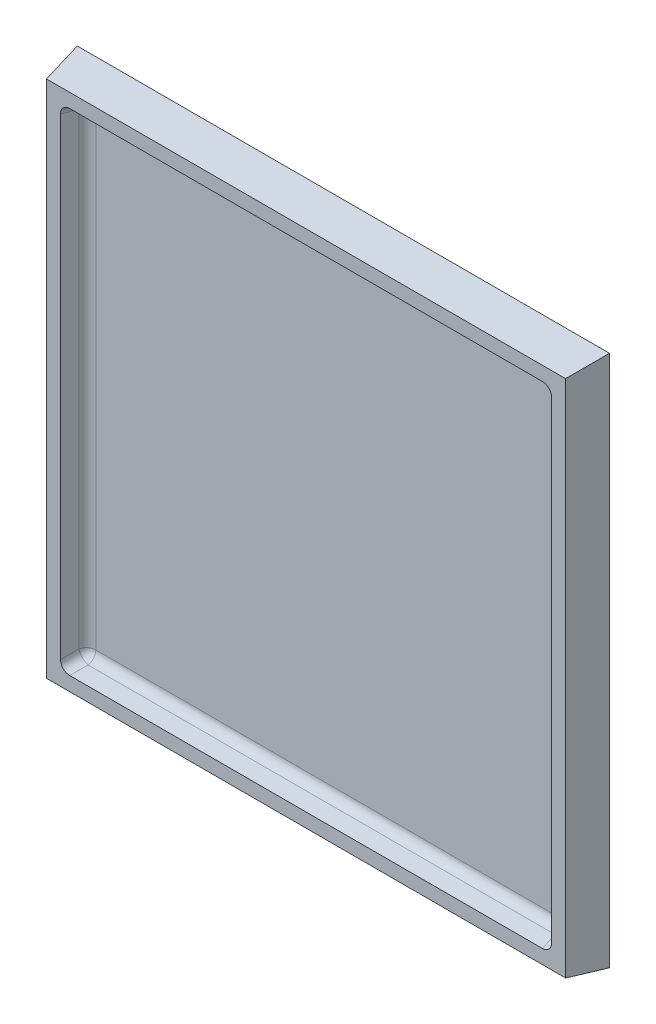
ISO-10303-21;
HEADER;
FILE_DESCRIPTION(('STEP AP214'),'2;1');
FILE_NAME('part.step','',(''),(''),'','','');
FILE_SCHEMA(('AUTOMOTIVE_DESIGN { 1 0 10303 214 1 1 1 1 }'));
ENDSEC;
DATA;
#1=APPLICATION_CONTEXT('core data for automotive mechanical design processes');
#2=APPLICATION_PROTOCOL_DEFINITION('international standard','automotive_design',2000,#1);
#3=PRODUCT_CONTEXT('',#1,'mechanical');
#4=PRODUCT('Part','Part','',(#3));
#5=PRODUCT_RELATED_PRODUCT_CATEGORY('part','',(#4));
#6=PRODUCT_DEFINITION_FORMATION('','',#4);
#7=PRODUCT_DEFINITION_CONTEXT('part definition',#1,'design');
#8=PRODUCT_DEFINITION('design','',#6,#7);
#9=PRODUCT_DEFINITION_SHAPE('','',#8);
#10=(LENGTH_UNIT() NAMED_UNIT(*) SI_UNIT(.MILLI.,.METRE.));
#11=(NAMED_UNIT(*) PLANE_ANGLE_UNIT() SI_UNIT($,.RADIAN.));
#12=(NAMED_UNIT(*) SI_UNIT($,.STERADIAN.) SOLID_ANGLE_UNIT());
#13=UNCERTAINTY_MEASURE_WITH_UNIT(LENGTH_MEASURE(1.E-05),#10,'distance_accuracy_value','');
#14=(GEOMETRIC_REPRESENTATION_CONTEXT(3) GLOBAL_UNCERTAINTY_ASSIGNED_CONTEXT((#13)) GLOBAL_UNIT_ASSIGNED_CONTEXT((#10,
#11,#12)) REPRESENTATION_CONTEXT('',''));
#15=CARTESIAN_POINT('',(0.,0.,0.));
#16=DIRECTION('',(0.,0.,1.));
#17=DIRECTION('',(1.,0.,0.));
#18=AXIS2_PLACEMENT_3D('',#15,#16,#17);
#19=CARTESIAN_POINT('',(0.,0.,1.5));
#20=DIRECTION('',(0.,0.,1.));
#21=DIRECTION('',(1.,0.,0.));
#22=AXIS2_PLACEMENT_3D('',#19,#20,#21);
#23=PLANE('',#22);
#24=DIRECTION('',(0.,1.,0.));
#25=VECTOR('',#24,1.);
#26=CARTESIAN_POINT('',(-25.0147749942177,-26.0517374046637,1.5));
#27=LINE('',#26,#25);
#28=CARTESIAN_POINT('',(-25.0147749942177,25.0147749942177,1.5));
#29=VERTEX_POINT('',#28);
#30=CARTESIAN_POINT('',(-25.0147749942177,-25.0147749942177,1.5));
#31=VERTEX_POINT('',#30);
#32=EDGE_CURVE('E182',#29,#31,#27,.F.);
#33=ORIENTED_EDGE('',*,*,#32,.T.);
#34=DIRECTION('',(-1.,0.,0.));
#35=VECTOR('',#34,1.);
#36=CARTESIAN_POINT('',(26.0449231509565,-25.0147749942177,1.5));
#37=LINE('',#36,#35);
#38=CARTESIAN_POINT('',(25.0147749942177,-25.0147749942177,1.5));
#39=VERTEX_POINT('',#38);
#40=EDGE_CURVE('E142',#31,#39,#37,.F.);
#41=ORIENTED_EDGE('',*,*,#40,.T.);
#42=DIRECTION('',(0.,-1.,0.));
#43=VECTOR('',#42,1.);
#44=CARTESIAN_POINT('',(25.0147749942177,26.0331586050858,1.5));
#45=LINE('',#44,#43);
#46=CARTESIAN_POINT('',(25.0147749942177,25.0147749942177,1.5));
#47=VERTEX_POINT('',#46);
#48=EDGE_CURVE('E133',#39,#47,#45,.F.);
#49=ORIENTED_EDGE('',*,*,#48,.T.);
#50=DIRECTION('',(1.,0.,0.));
#51=VECTOR('',#50,1.);
#52=CARTESIAN_POINT('',(-26.070228208588,25.0147749942177,1.5));
#53=LINE('',#52,#51);
#54=EDGE_CURVE('E113',#47,#29,#53,.F.);
#55=ORIENTED_EDGE('',*,*,#54,.T.);
#56=EDGE_LOOP('',(#33,#41,#49,#55));
#57=FACE_BOUND('',#56,.T.);
#58=ADVANCED_FACE('F16',(#57),#23,.T.);
#59=CARTESIAN_POINT('',(-25.0147749942177,25.0147749942177,2.5));
#60=DIRECTION('',(0.,-0.766044443118978,-0.64278760968654));
#61=DIRECTION('',(0.,0.64278760968654,-0.766044443118978));
#62=AXIS2_PLACEMENT_3D('',#59,#60,#61);
#63=SPHERICAL_SURFACE('',#62,1.);
#64=CARTESIAN_POINT('',(-25.0147749942177,25.0147749942177,2.5));
#65=DIRECTION('',(1.,0.,0.));
#66=DIRECTION('',(0.,0.,-1.));
#67=AXIS2_PLACEMENT_3D('',#64,#65,#66);
#68=CIRCLE('',#67,1.);
#69=CARTESIAN_POINT('',(-25.0147749942177,25.9995827472299,2.32635182233307));
#70=VERTEX_POINT('',#69);
#71=EDGE_CURVE('E119',#29,#70,#68,.T.);
#72=ORIENTED_EDGE('',*,*,#71,.T.);
#73=CARTESIAN_POINT('',(-25.0147749942177,25.0147749942177,2.5));
#74=DIRECTION('',(0.171087869746035,-0.171087869746035,-0.970287525247814));
#75=DIRECTION('',(-0.984807753012208,0.,-0.17364817766693));
#76=AXIS2_PLACEMENT_3D('',#73,#74,#75);
#77=CIRCLE('',#76,1.);
#78=CARTESIAN_POINT('',(-25.9995827472299,25.0147749942177,2.32635182233307));
#79=VERTEX_POINT('',#78);
#80=EDGE_CURVE('E173',#70,#79,#77,.F.);
#81=ORIENTED_EDGE('',*,*,#80,.T.);
#82=CARTESIAN_POINT('',(-25.0147749942177,25.0147749942177,2.5));
#83=DIRECTION('',(0.,1.,0.));
#84=DIRECTION('',(0.,0.,1.));
#85=AXIS2_PLACEMENT_3D('',#82,#83,#84);
#86=CIRCLE('',#85,1.);
#87=EDGE_CURVE('E177',#79,#29,#86,.F.);
#88=ORIENTED_EDGE('',*,*,#87,.T.);
#89=EDGE_LOOP('',(#72,#81,#88));
#90=FACE_BOUND('',#89,.T.);
#91=ADVANCED_FACE('F243',(#90),#63,.F.);
#92=CARTESIAN_POINT('',(-26.070228208588,25.0147749942177,2.5));
#93=DIRECTION('',(1.,0.,0.));
#94=DIRECTION('',(0.,0.,-1.));
#95=AXIS2_PLACEMENT_3D('',#92,#93,#94);
#96=CYLINDRICAL_SURFACE('',#95,1.);
#97=ORIENTED_EDGE('',*,*,#54,.F.);
#98=CARTESIAN_POINT('',(25.0147749942177,25.0147749942177,2.5));
#99=DIRECTION('',(1.,0.,0.));
#100=DIRECTION('',(0.,0.,-1.));
#101=AXIS2_PLACEMENT_3D('',#98,#99,#100);
#102=CIRCLE('',#101,1.);
#103=CARTESIAN_POINT('',(25.0147749942177,25.9995827472299,2.32635182233307));
#104=VERTEX_POINT('',#103);
#105=EDGE_CURVE('E19',#47,#104,#102,.T.);
#106=ORIENTED_EDGE('',*,*,#105,.T.);
#107=DIRECTION('',(1.,0.,0.));
#108=VECTOR('',#107,1.);
#109=CARTESIAN_POINT('',(28.3587463614957,25.9995827472299,2.32635182233307));
#110=LINE('',#109,#108);
#111=EDGE_CURVE('E176',#104,#70,#110,.F.);
#112=ORIENTED_EDGE('',*,*,#111,.T.);
#113=ORIENTED_EDGE('',*,*,#71,.F.);
#114=EDGE_LOOP('',(#97,#106,#112,#113));
#115=FACE_BOUND('',#114,.T.);
#116=ADVANCED_FACE('F115',(#115),#96,.F.);
#117=CARTESIAN_POINT('',(25.0147749942177,25.0147749942177,2.5));
#118=DIRECTION('',(0.,0.766044443118978,0.64278760968654));
#119=DIRECTION('',(0.,0.64278760968654,-0.766044443118978));
#120=AXIS2_PLACEMENT_3D('',#117,#118,#119);
#121=SPHERICAL_SURFACE('',#120,1.);
#122=CARTESIAN_POINT('',(25.0147749942177,25.0147749942177,2.5));
#123=DIRECTION('',(0.,-1.,0.));
#124=DIRECTION('',(0.,0.,-1.));
#125=AXIS2_PLACEMENT_3D('',#122,#123,#124);
#126=CIRCLE('',#125,1.);
#127=CARTESIAN_POINT('',(25.9995827472299,25.0147749942177,2.32635182233307));
#128=VERTEX_POINT('',#127);
#129=EDGE_CURVE('E130',#47,#128,#126,.T.);
#130=ORIENTED_EDGE('',*,*,#129,.T.);
#131=CARTESIAN_POINT('',(25.0147749942177,25.0147749942177,2.5));
#132=DIRECTION('',(-0.171087869746035,-0.171087869746035,-0.970287525247814));
#133=DIRECTION('',(-0.984807753012208,0.,0.17364817766693));
#134=AXIS2_PLACEMENT_3D('',#131,#132,#133);
#135=CIRCLE('',#134,1.);
#136=EDGE_CURVE('E132',#128,#104,#135,.F.);
#137=ORIENTED_EDGE('',*,*,#136,.T.);
#138=ORIENTED_EDGE('',*,*,#105,.F.);
#139=EDGE_LOOP('',(#130,#137,#138));
#140=FACE_BOUND('',#139,.T.);
#141=ADVANCED_FACE('F129',(#140),#121,.F.);
#142=CARTESIAN_POINT('',(25.0147749942177,26.0331586050858,2.5));
#143=DIRECTION('',(0.,-1.,0.));
#144=DIRECTION('',(0.,0.,-1.));
#145=AXIS2_PLACEMENT_3D('',#142,#143,#144);
#146=CYLINDRICAL_SURFACE('',#145,1.);
#147=DIRECTION('',(0.,1.,0.));
#148=VECTOR('',#147,1.);
#149=CARTESIAN_POINT('',(25.9995827472299,-28.3587463614957,2.32635182233307));
#150=LINE('',#149,#148);
#151=CARTESIAN_POINT('',(25.9995827472299,-25.0147749942177,2.32635182233307));
#152=VERTEX_POINT('',#151);
#153=EDGE_CURVE('E139',#152,#128,#150,.T.);
#154=ORIENTED_EDGE('',*,*,#153,.T.);
#155=ORIENTED_EDGE('',*,*,#129,.F.);
#156=ORIENTED_EDGE('',*,*,#48,.F.);
#157=CARTESIAN_POINT('',(25.0147749942177,-25.0147749942177,2.5));
#158=DIRECTION('',(0.,-1.,0.));
#159=DIRECTION('',(0.,0.,-1.));
#160=AXIS2_PLACEMENT_3D('',#157,#158,#159);
#161=CIRCLE('',#160,1.);
#162=EDGE_CURVE('E140',#39,#152,#161,.T.);
#163=ORIENTED_EDGE('',*,*,#162,.T.);
#164=EDGE_LOOP('',(#154,#155,#156,#163));
#165=FACE_BOUND('',#164,.T.);
#166=ADVANCED_FACE('F136',(#165),#146,.F.);
#167=CARTESIAN_POINT('',(25.0147749942177,-25.0147749942177,2.5));
#168=DIRECTION('',(0.,0.766044443118978,-0.64278760968654));
#169=DIRECTION('',(0.,-0.64278760968654,-0.766044443118978));
#170=AXIS2_PLACEMENT_3D('',#167,#168,#169);
#171=SPHERICAL_SURFACE('',#170,1.);
#172=CARTESIAN_POINT('',(25.0147749942177,-25.0147749942177,2.5));
#173=DIRECTION('',(-1.,0.,0.));
#174=DIRECTION('',(0.,0.,1.));
#175=AXIS2_PLACEMENT_3D('',#172,#173,#174);
#176=CIRCLE('',#175,1.);
#177=CARTESIAN_POINT('',(25.0147749942177,-25.9995827472299,2.32635182233307));
#178=VERTEX_POINT('',#177);
#179=EDGE_CURVE('E186',#39,#178,#176,.T.);
#180=ORIENTED_EDGE('',*,*,#179,.T.);
#181=CARTESIAN_POINT('',(25.0147749942177,-25.0147749942177,2.5));
#182=DIRECTION('',(-0.171087869746035,0.171087869746035,-0.970287525247814));
#183=DIRECTION('',(-0.984807753012208,0.,0.17364817766693));
#184=AXIS2_PLACEMENT_3D('',#181,#182,#183);
#185=CIRCLE('',#184,1.);
#186=EDGE_CURVE('E165',#178,#152,#185,.F.);
#187=ORIENTED_EDGE('',*,*,#186,.T.);
#188=ORIENTED_EDGE('',*,*,#162,.F.);
#189=EDGE_LOOP('',(#180,#187,#188));
#190=FACE_BOUND('',#189,.T.);
#191=ADVANCED_FACE('F201',(#190),#171,.F.);
#192=CARTESIAN_POINT('',(26.0449231509565,-25.0147749942177,2.5));
#193=DIRECTION('',(-1.,0.,0.));
#194=DIRECTION('',(0.,0.,1.));
#195=AXIS2_PLACEMENT_3D('',#192,#193,#194);
#196=CYLINDRICAL_SURFACE('',#195,1.);
#197=DIRECTION('',(1.,0.,0.));
#198=VECTOR('',#197,1.);
#199=CARTESIAN_POINT('',(-28.3587463614957,-25.9995827472299,2.32635182233307));
#200=LINE('',#199,#198);
#201=CARTESIAN_POINT('',(-25.0147749942177,-25.9995827472299,2.32635182233307));
#202=VERTEX_POINT('',#201);
#203=EDGE_CURVE('E199',#202,#178,#200,.T.);
#204=ORIENTED_EDGE('',*,*,#203,.T.);
#205=ORIENTED_EDGE('',*,*,#179,.F.);
#206=ORIENTED_EDGE('',*,*,#40,.F.);
#207=CARTESIAN_POINT('',(-25.0147749942177,-25.0147749942177,2.5));
#208=DIRECTION('',(-1.,0.,0.));
#209=DIRECTION('',(0.,0.,1.));
#210=AXIS2_PLACEMENT_3D('',#207,#208,#209);
#211=CIRCLE('',#210,1.);
#212=EDGE_CURVE('E183',#31,#202,#211,.T.);
#213=ORIENTED_EDGE('',*,*,#212,.T.);
#214=EDGE_LOOP('',(#204,#205,#206,#213));
#215=FACE_BOUND('',#214,.T.);
#216=ADVANCED_FACE('F210',(#215),#196,.F.);
#217=CARTESIAN_POINT('',(-25.0147749942177,-25.0147749942177,2.5));
#218=DIRECTION('',(0.766044443118978,0.,-0.64278760968654));
#219=DIRECTION('',(-0.64278760968654,0.,-0.766044443118978));
#220=AXIS2_PLACEMENT_3D('',#217,#218,#219);
#221=SPHERICAL_SURFACE('',#220,1.);
#222=CARTESIAN_POINT('',(-25.0147749942177,-25.0147749942177,2.5));
#223=DIRECTION('',(0.,1.,0.));
#224=DIRECTION('',(0.,0.,1.));
#225=AXIS2_PLACEMENT_3D('',#222,#223,#224);
#226=CIRCLE('',#225,1.);
#227=CARTESIAN_POINT('',(-25.9995827472299,-25.0147749942177,2.32635182233307));
#228=VERTEX_POINT('',#227);
#229=EDGE_CURVE('E179',#31,#228,#226,.T.);
#230=ORIENTED_EDGE('',*,*,#229,.T.);
#231=CARTESIAN_POINT('',(-25.0147749942177,-25.0147749942177,2.5));
#232=DIRECTION('',(0.171087869746035,0.171087869746035,-0.970287525247814));
#233=DIRECTION('',(-0.984807753012208,0.,-0.17364817766693));
#234=AXIS2_PLACEMENT_3D('',#231,#232,#233);
#235=CIRCLE('',#234,1.);
#236=EDGE_CURVE('E160',#228,#202,#235,.F.);
#237=ORIENTED_EDGE('',*,*,#236,.T.);
#238=ORIENTED_EDGE('',*,*,#212,.F.);
#239=EDGE_LOOP('',(#230,#237,#238));
#240=FACE_BOUND('',#239,.T.);
#241=ADVANCED_FACE('F222',(#240),#221,.F.);
#242=CARTESIAN_POINT('',(-25.0147749942177,-26.0517374046637,2.5));
#243=DIRECTION('',(0.,1.,0.));
#244=DIRECTION('',(0.,0.,1.));
#245=AXIS2_PLACEMENT_3D('',#242,#243,#244);
#246=CYLINDRICAL_SURFACE('',#245,1.);
#247=DIRECTION('',(0.,1.,0.));
#248=VECTOR('',#247,1.);
#249=CARTESIAN_POINT('',(-25.9995827472299,28.3587463614957,2.32635182233307));
#250=LINE('',#249,#248);
#251=EDGE_CURVE('E216',#79,#228,#250,.F.);
#252=ORIENTED_EDGE('',*,*,#251,.T.);
#253=ORIENTED_EDGE('',*,*,#229,.F.);
#254=ORIENTED_EDGE('',*,*,#32,.F.);
#255=ORIENTED_EDGE('',*,*,#87,.F.);
#256=EDGE_LOOP('',(#252,#253,#254,#255));
#257=FACE_BOUND('',#256,.T.);
#258=ADVANCED_FACE('F226',(#257),#246,.F.);
#259=CARTESIAN_POINT('',(-25.3339775101865,25.3339775101865,4.31028742559028));
#260=DIRECTION('',(0.171087869746035,-0.171087869746035,-0.970287525247814));
#261=DIRECTION('',(-0.984807753012208,0.,-0.17364817766693));
#262=AXIS2_PLACEMENT_3D('',#259,#260,#261);
#263=CYLINDRICAL_SURFACE('',#262,1.);
#264=CARTESIAN_POINT('',(-25.2792654652804,25.2792654652804,4.));
#265=DIRECTION('',(0.,0.,1.));
#266=DIRECTION('',(0.707106781186548,-0.707106781186548,0.));
#267=AXIS2_PLACEMENT_3D('',#264,#265,#266);
#268=ELLIPSE('',#267,1.03062234026414,1.);
#269=CARTESIAN_POINT('',(-26.2946920771661,25.3098843241539,4.));
#270=VERTEX_POINT('',#269);
#271=CARTESIAN_POINT('',(-25.3098843241539,26.2946920771661,4.));
#272=VERTEX_POINT('',#271);
#273=EDGE_CURVE('E157',#270,#272,#268,.F.);
#274=ORIENTED_EDGE('',*,*,#273,.F.);
#275=DIRECTION('',(0.171087869746035,-0.171087869746035,-0.970287525247814));
#276=VECTOR('',#275,1.);
#277=CARTESIAN_POINT('',(-26.2946920771661,25.3098843241539,4.));
#278=LINE('',#277,#276);
#279=EDGE_CURVE('E159',#270,#79,#278,.T.);
#280=ORIENTED_EDGE('',*,*,#279,.T.);
#281=ORIENTED_EDGE('',*,*,#80,.F.);
#282=DIRECTION('',(-0.171087869746035,0.171087869746035,0.970287525247814));
#283=VECTOR('',#282,1.);
#284=CARTESIAN_POINT('',(-25.0147749942177,25.9995827472299,2.32635182233307));
#285=LINE('',#284,#283);
#286=EDGE_CURVE('E172',#70,#272,#285,.T.);
#287=ORIENTED_EDGE('',*,*,#286,.T.);
#288=EDGE_LOOP('',(#274,#280,#281,#287));
#289=FACE_BOUND('',#288,.T.);
#290=ADVANCED_FACE('F276',(#289),#263,.F.);
#291=CARTESIAN_POINT('',(28.3587463614957,26.2946920771661,4.));
#292=DIRECTION('',(0.,0.984807753012208,-0.17364817766693));
#293=DIRECTION('',(0.,0.17364817766693,0.984807753012208));
#294=AXIS2_PLACEMENT_3D('',#291,#292,#293);
#295=PLANE('',#294);
#296=DIRECTION('',(1.,0.,0.));
#297=VECTOR('',#296,1.);
#298=CARTESIAN_POINT('',(0.,26.2946920771661,4.));
#299=LINE('',#298,#297);
#300=CARTESIAN_POINT('',(25.3098843241539,26.2946920771661,4.));
#301=VERTEX_POINT('',#300);
#302=EDGE_CURVE('E156',#272,#301,#299,.T.);
#303=ORIENTED_EDGE('',*,*,#302,.F.);
#304=ORIENTED_EDGE('',*,*,#286,.F.);
#305=ORIENTED_EDGE('',*,*,#111,.F.);
#306=DIRECTION('',(-0.171087869746035,-0.171087869746035,-0.970287525247814));
#307=VECTOR('',#306,1.);
#308=CARTESIAN_POINT('',(25.3339775101865,26.3187852631987,4.13663924792335));
#309=LINE('',#308,#307);
#310=EDGE_CURVE('E171',#104,#301,#309,.F.);
#311=ORIENTED_EDGE('',*,*,#310,.T.);
#312=EDGE_LOOP('',(#303,#304,#305,#311));
#313=FACE_BOUND('',#312,.T.);
#314=ADVANCED_FACE('F279',(#313),#295,.F.);
#315=CARTESIAN_POINT('',(25.3339775101865,25.3339775101865,4.31028742559028));
#316=DIRECTION('',(-0.171087869746035,-0.171087869746035,-0.970287525247814));
#317=DIRECTION('',(-0.984807753012208,0.,0.17364817766693));
#318=AXIS2_PLACEMENT_3D('',#315,#316,#317);
#319=CYLINDRICAL_SURFACE('',#318,1.);
#320=CARTESIAN_POINT('',(25.2792654652804,25.2792654652804,4.));
#321=DIRECTION('',(0.,0.,1.));
#322=DIRECTION('',(-0.707106781186548,-0.707106781186548,0.));
#323=AXIS2_PLACEMENT_3D('',#320,#321,#322);
#324=ELLIPSE('',#323,1.03062234026414,1.);
#325=CARTESIAN_POINT('',(26.2946920771661,25.3098843241539,4.));
#326=VERTEX_POINT('',#325);
#327=EDGE_CURVE('E154',#301,#326,#324,.F.);
#328=ORIENTED_EDGE('',*,*,#327,.F.);
#329=ORIENTED_EDGE('',*,*,#310,.F.);
#330=ORIENTED_EDGE('',*,*,#136,.F.);
#331=DIRECTION('',(0.171087869746035,0.171087869746035,0.970287525247814));
#332=VECTOR('',#331,1.);
#333=CARTESIAN_POINT('',(25.9995827472299,25.0147749942177,2.32635182233307));
#334=LINE('',#333,#332);
#335=EDGE_CURVE('E169',#128,#326,#334,.T.);
#336=ORIENTED_EDGE('',*,*,#335,.T.);
#337=EDGE_LOOP('',(#328,#329,#330,#336));
#338=FACE_BOUND('',#337,.T.);
#339=ADVANCED_FACE('F292',(#338),#319,.F.);
#340=CARTESIAN_POINT('',(26.2946920771661,-28.3587463614957,4.));
#341=DIRECTION('',(0.984807753012208,0.,-0.17364817766693));
#342=DIRECTION('',(-0.17364817766693,0.,-0.984807753012208));
#343=AXIS2_PLACEMENT_3D('',#340,#341,#342);
#344=PLANE('',#343);
#345=DIRECTION('',(0.,1.,0.));
#346=VECTOR('',#345,1.);
#347=CARTESIAN_POINT('',(26.2946920771661,0.,4.));
#348=LINE('',#347,#346);
#349=CARTESIAN_POINT('',(26.2946920771661,-25.3098843241539,4.));
#350=VERTEX_POINT('',#349);
#351=EDGE_CURVE('E153',#326,#350,#348,.F.);
#352=ORIENTED_EDGE('',*,*,#351,.F.);
#353=ORIENTED_EDGE('',*,*,#335,.F.);
#354=ORIENTED_EDGE('',*,*,#153,.F.);
#355=DIRECTION('',(-0.171087869746035,0.171087869746035,-0.970287525247814));
#356=VECTOR('',#355,1.);
#357=CARTESIAN_POINT('',(26.3187852631987,-25.3339775101865,4.13663924792335));
#358=LINE('',#357,#356);
#359=EDGE_CURVE('E168',#152,#350,#358,.F.);
#360=ORIENTED_EDGE('',*,*,#359,.T.);
#361=EDGE_LOOP('',(#352,#353,#354,#360));
#362=FACE_BOUND('',#361,.T.);
#363=ADVANCED_FACE('F290',(#362),#344,.F.);
#364=CARTESIAN_POINT('',(25.3339775101865,-25.3339775101865,4.31028742559028));
#365=DIRECTION('',(-0.171087869746035,0.171087869746035,-0.970287525247814));
#366=DIRECTION('',(-0.984807753012208,0.,0.17364817766693));
#367=AXIS2_PLACEMENT_3D('',#364,#365,#366);
#368=CYLINDRICAL_SURFACE('',#367,1.);
#369=CARTESIAN_POINT('',(25.2792654652804,-25.2792654652804,4.));
#370=DIRECTION('',(0.,0.,1.));
#371=DIRECTION('',(-0.707106781186548,0.707106781186548,0.));
#372=AXIS2_PLACEMENT_3D('',#369,#370,#371);
#373=ELLIPSE('',#372,1.03062234026414,1.);
#374=CARTESIAN_POINT('',(25.3098843241539,-26.2946920771661,4.));
#375=VERTEX_POINT('',#374);
#376=EDGE_CURVE('E151',#350,#375,#373,.F.);
#377=ORIENTED_EDGE('',*,*,#376,.F.);
#378=ORIENTED_EDGE('',*,*,#359,.F.);
#379=ORIENTED_EDGE('',*,*,#186,.F.);
#380=DIRECTION('',(0.171087869746035,-0.171087869746035,0.970287525247814));
#381=VECTOR('',#380,1.);
#382=CARTESIAN_POINT('',(25.0147749942177,-25.9995827472299,2.32635182233307));
#383=LINE('',#382,#381);
#384=EDGE_CURVE('E164',#178,#375,#383,.T.);
#385=ORIENTED_EDGE('',*,*,#384,.T.);
#386=EDGE_LOOP('',(#377,#378,#379,#385));
#387=FACE_BOUND('',#386,.T.);
#388=ADVANCED_FACE('F195',(#387),#368,.F.);
#389=CARTESIAN_POINT('',(-28.3587463614957,-26.2946920771661,4.));
#390=DIRECTION('',(0.,-0.984807753012208,-0.17364817766693));
#391=DIRECTION('',(0.,0.17364817766693,-0.984807753012208));
#392=AXIS2_PLACEMENT_3D('',#389,#390,#391);
#393=PLANE('',#392);
#394=DIRECTION('',(1.,0.,0.));
#395=VECTOR('',#394,1.);
#396=CARTESIAN_POINT('',(0.,-26.2946920771661,4.));
#397=LINE('',#396,#395);
#398=CARTESIAN_POINT('',(-25.3098843241539,-26.2946920771661,4.));
#399=VERTEX_POINT('',#398);
#400=EDGE_CURVE('E150',#375,#399,#397,.F.);
#401=ORIENTED_EDGE('',*,*,#400,.F.);
#402=ORIENTED_EDGE('',*,*,#384,.F.);
#403=ORIENTED_EDGE('',*,*,#203,.F.);
#404=DIRECTION('',(0.171087869746035,0.171087869746035,-0.970287525247814));
#405=VECTOR('',#404,1.);
#406=CARTESIAN_POINT('',(-25.3339775101865,-26.3187852631987,4.13663924792335));
#407=LINE('',#406,#405);
#408=EDGE_CURVE('E163',#202,#399,#407,.F.);
#409=ORIENTED_EDGE('',*,*,#408,.T.);
#410=EDGE_LOOP('',(#401,#402,#403,#409));
#411=FACE_BOUND('',#410,.T.);
#412=ADVANCED_FACE('F207',(#411),#393,.F.);
#413=CARTESIAN_POINT('',(-25.3339775101865,-25.3339775101865,4.31028742559028));
#414=DIRECTION('',(0.171087869746035,0.171087869746035,-0.970287525247814));
#415=DIRECTION('',(-0.984807753012208,0.,-0.17364817766693));
#416=AXIS2_PLACEMENT_3D('',#413,#414,#415);
#417=CYLINDRICAL_SURFACE('',#416,1.);
#418=CARTESIAN_POINT('',(-25.2792654652804,-25.2792654652804,4.));
#419=DIRECTION('',(0.,0.,1.));
#420=DIRECTION('',(0.707106781186548,0.707106781186548,0.));
#421=AXIS2_PLACEMENT_3D('',#418,#419,#420);
#422=ELLIPSE('',#421,1.03062234026414,1.);
#423=CARTESIAN_POINT('',(-26.2946920771661,-25.3098843241539,4.));
#424=VERTEX_POINT('',#423);
#425=EDGE_CURVE('E147',#399,#424,#422,.F.);
#426=ORIENTED_EDGE('',*,*,#425,.F.);
#427=ORIENTED_EDGE('',*,*,#408,.F.);
#428=ORIENTED_EDGE('',*,*,#236,.F.);
#429=DIRECTION('',(-0.171087869746035,-0.171087869746035,0.970287525247814));
#430=VECTOR('',#429,1.);
#431=CARTESIAN_POINT('',(-25.9995827472299,-25.0147749942177,2.32635182233307));
#432=LINE('',#431,#430);
#433=EDGE_CURVE('E256',#228,#424,#432,.T.);
#434=ORIENTED_EDGE('',*,*,#433,.T.);
#435=EDGE_LOOP('',(#426,#427,#428,#434));
#436=FACE_BOUND('',#435,.T.);
#437=ADVANCED_FACE('F329',(#436),#417,.F.);
#438=CARTESIAN_POINT('',(-26.2946920771661,28.3587463614957,4.));
#439=DIRECTION('',(-0.984807753012208,0.,-0.17364817766693));
#440=DIRECTION('',(-0.17364817766693,0.,0.984807753012208));
#441=AXIS2_PLACEMENT_3D('',#438,#439,#440);
#442=PLANE('',#441);
#443=DIRECTION('',(0.,1.,0.));
#444=VECTOR('',#443,1.);
#445=CARTESIAN_POINT('',(-26.2946920771661,0.,4.));
#446=LINE('',#445,#444);
#447=EDGE_CURVE('E149',#424,#270,#446,.T.);
#448=ORIENTED_EDGE('',*,*,#447,.F.);
#449=ORIENTED_EDGE('',*,*,#433,.F.);
#450=ORIENTED_EDGE('',*,*,#251,.F.);
#451=ORIENTED_EDGE('',*,*,#279,.F.);
#452=EDGE_LOOP('',(#448,#449,#450,#451));
#453=FACE_BOUND('',#452,.T.);
#454=ADVANCED_FACE('F257',(#453),#442,.F.);
#455=CARTESIAN_POINT('',(0.,0.,4.));
#456=DIRECTION('',(0.,0.,1.));
#457=DIRECTION('',(1.,0.,0.));
#458=AXIS2_PLACEMENT_3D('',#455,#456,#457);
#459=PLANE('',#458);
#460=ORIENTED_EDGE('',*,*,#425,.T.);
#461=ORIENTED_EDGE('',*,*,#447,.T.);
#462=ORIENTED_EDGE('',*,*,#273,.T.);
#463=ORIENTED_EDGE('',*,*,#302,.T.);
#464=ORIENTED_EDGE('',*,*,#327,.T.);
#465=ORIENTED_EDGE('',*,*,#351,.T.);
#466=ORIENTED_EDGE('',*,*,#376,.T.);
#467=ORIENTED_EDGE('',*,*,#400,.T.);
#468=EDGE_LOOP('',(#460,#461,#462,#463,#464,#465,#466,#467));
#469=FACE_BOUND('',#468,.T.);
#470=DIRECTION('',(1.,0.,0.));
#471=VECTOR('',#470,1.);
#472=CARTESIAN_POINT('',(30.5640542843295,27.7946920771661,4.));
#473=LINE('',#472,#471);
#474=CARTESIAN_POINT('',(-27.7946920771662,27.7946920771661,4.));
#475=VERTEX_POINT('',#474);
#476=CARTESIAN_POINT('',(27.7946920771661,27.7946920771662,4.));
#477=VERTEX_POINT('',#476);
#478=EDGE_CURVE('E466',#475,#477,#473,.T.);
#479=ORIENTED_EDGE('',*,*,#478,.F.);
#480=DIRECTION('',(0.,1.,0.));
#481=VECTOR('',#480,1.);
#482=CARTESIAN_POINT('',(-27.7946920771661,30.5640542843295,4.));
#483=LINE('',#482,#481);
#484=CARTESIAN_POINT('',(-27.7946920771661,-27.7946920771662,4.));
#485=VERTEX_POINT('',#484);
#486=EDGE_CURVE('E284',#485,#475,#483,.T.);
#487=ORIENTED_EDGE('',*,*,#486,.F.);
#488=DIRECTION('',(1.,0.,0.));
#489=VECTOR('',#488,1.);
#490=CARTESIAN_POINT('',(-30.5640542843295,-27.7946920771661,4.));
#491=LINE('',#490,#489);
#492=CARTESIAN_POINT('',(27.7946920771662,-27.7946920771661,4.));
#493=VERTEX_POINT('',#492);
#494=EDGE_CURVE('E286',#493,#485,#491,.F.);
#495=ORIENTED_EDGE('',*,*,#494,.F.);
#496=DIRECTION('',(0.,1.,0.));
#497=VECTOR('',#496,1.);
#498=CARTESIAN_POINT('',(27.7946920771661,-30.5640542843295,4.));
#499=LINE('',#498,#497);
#500=EDGE_CURVE('E481',#477,#493,#499,.F.);
#501=ORIENTED_EDGE('',*,*,#500,.F.);
#502=EDGE_LOOP('',(#479,#487,#495,#501));
#503=FACE_BOUND('',#502,.T.);
#504=ADVANCED_FACE('F282',(#469,#503),#459,.T.);
#505=CARTESIAN_POINT('',(-28.5,30.5640542843295,0.));
#506=DIRECTION('',(-0.984807753012208,0.,0.17364817766693));
#507=DIRECTION('',(0.17364817766693,0.,0.984807753012208));
#508=AXIS2_PLACEMENT_3D('',#505,#506,#507);
#509=PLANE('',#508);
#510=DIRECTION('',(0.171087869746036,-0.171087869746036,0.970287525247814));
#511=VECTOR('',#510,1.);
#512=CARTESIAN_POINT('',(-28.5,28.5,0.));
#513=LINE('',#512,#511);
#514=CARTESIAN_POINT('',(-28.5,28.5,0.));
#515=VERTEX_POINT('',#514);
#516=EDGE_CURVE('E461',#515,#475,#513,.T.);
#517=ORIENTED_EDGE('',*,*,#516,.F.);
#518=DIRECTION('',(0.,1.,0.));
#519=VECTOR('',#518,1.);
#520=CARTESIAN_POINT('',(-28.5,0.,0.));
#521=LINE('',#520,#519);
#522=CARTESIAN_POINT('',(-28.5,-28.5,0.));
#523=VERTEX_POINT('',#522);
#524=EDGE_CURVE('E463',#515,#523,#521,.F.);
#525=ORIENTED_EDGE('',*,*,#524,.T.);
#526=DIRECTION('',(-0.171087869746036,-0.171087869746036,-0.970287525247814));
#527=VECTOR('',#526,1.);
#528=CARTESIAN_POINT('',(-27.7946920771661,-27.7946920771661,4.));
#529=LINE('',#528,#527);
#530=EDGE_CURVE('E483',#485,#523,#529,.T.);
#531=ORIENTED_EDGE('',*,*,#530,.F.);
#532=ORIENTED_EDGE('',*,*,#486,.T.);
#533=EDGE_LOOP('',(#517,#525,#531,#532));
#534=FACE_BOUND('',#533,.T.);
#535=ADVANCED_FACE('F320',(#534),#509,.T.);
#536=CARTESIAN_POINT('',(-30.5640542843295,-28.5,0.));
#537=DIRECTION('',(0.,-0.984807753012208,0.17364817766693));
#538=DIRECTION('',(0.,-0.17364817766693,-0.984807753012208));
#539=AXIS2_PLACEMENT_3D('',#536,#537,#538);
#540=PLANE('',#539);
#541=ORIENTED_EDGE('',*,*,#530,.T.);
#542=DIRECTION('',(1.,0.,0.));
#543=VECTOR('',#542,1.);
#544=CARTESIAN_POINT('',(0.,-28.5,0.));
#545=LINE('',#544,#543);
#546=CARTESIAN_POINT('',(28.5,-28.5,0.));
#547=VERTEX_POINT('',#546);
#548=EDGE_CURVE('E473',#523,#547,#545,.T.);
#549=ORIENTED_EDGE('',*,*,#548,.T.);
#550=DIRECTION('',(0.171087869746036,-0.171087869746036,-0.970287525247814));
#551=VECTOR('',#550,1.);
#552=CARTESIAN_POINT('',(27.7946920771661,-27.7946920771661,4.));
#553=LINE('',#552,#551);
#554=EDGE_CURVE('E467',#493,#547,#553,.T.);
#555=ORIENTED_EDGE('',*,*,#554,.F.);
#556=ORIENTED_EDGE('',*,*,#494,.T.);
#557=EDGE_LOOP('',(#541,#549,#555,#556));
#558=FACE_BOUND('',#557,.T.);
#559=ADVANCED_FACE('F316',(#558),#540,.T.);
#560=CARTESIAN_POINT('',(28.5,-30.5640542843295,0.));
#561=DIRECTION('',(0.984807753012208,0.,0.17364817766693));
#562=DIRECTION('',(0.17364817766693,0.,-0.984807753012208));
#563=AXIS2_PLACEMENT_3D('',#560,#561,#562);
#564=PLANE('',#563);
#565=ORIENTED_EDGE('',*,*,#554,.T.);
#566=DIRECTION('',(0.,1.,0.));
#567=VECTOR('',#566,1.);
#568=CARTESIAN_POINT('',(28.5,0.,0.));
#569=LINE('',#568,#567);
#570=CARTESIAN_POINT('',(28.5,28.5,0.));
#571=VERTEX_POINT('',#570);
#572=EDGE_CURVE('E25',#547,#571,#569,.T.);
#573=ORIENTED_EDGE('',*,*,#572,.T.);
#574=DIRECTION('',(0.171087869746036,0.171087869746036,-0.970287525247814));
#575=VECTOR('',#574,1.);
#576=CARTESIAN_POINT('',(27.7946920771661,27.7946920771661,4.));
#577=LINE('',#576,#575);
#578=EDGE_CURVE('E33',#477,#571,#577,.T.);
#579=ORIENTED_EDGE('',*,*,#578,.F.);
#580=ORIENTED_EDGE('',*,*,#500,.T.);
#581=EDGE_LOOP('',(#565,#573,#579,#580));
#582=FACE_BOUND('',#581,.T.);
#583=ADVANCED_FACE('F310',(#582),#564,.T.);
#584=CARTESIAN_POINT('',(30.5640542843295,28.5,0.));
#585=DIRECTION('',(0.,0.984807753012208,0.17364817766693));
#586=DIRECTION('',(0.,-0.17364817766693,0.984807753012208));
#587=AXIS2_PLACEMENT_3D('',#584,#585,#586);
#588=PLANE('',#587);
#589=ORIENTED_EDGE('',*,*,#578,.T.);
#590=DIRECTION('',(1.,0.,0.));
#591=VECTOR('',#590,1.);
#592=CARTESIAN_POINT('',(0.,28.5,0.));
#593=LINE('',#592,#591);
#594=EDGE_CURVE('E10',#571,#515,#593,.F.);
#595=ORIENTED_EDGE('',*,*,#594,.T.);
#596=ORIENTED_EDGE('',*,*,#516,.T.);
#597=ORIENTED_EDGE('',*,*,#478,.T.);
#598=EDGE_LOOP('',(#589,#595,#596,#597));
#599=FACE_BOUND('',#598,.T.);
#600=ADVANCED_FACE('F304',(#599),#588,.T.);
#601=CARTESIAN_POINT('',(0.,0.,0.));
#602=DIRECTION('',(0.,0.,1.));
#603=DIRECTION('',(1.,0.,0.));
#604=AXIS2_PLACEMENT_3D('',#601,#602,#603);
#605=PLANE('',#604);
#606=ORIENTED_EDGE('',*,*,#572,.F.);
#607=ORIENTED_EDGE('',*,*,#548,.F.);
#608=ORIENTED_EDGE('',*,*,#524,.F.);
#609=ORIENTED_EDGE('',*,*,#594,.F.);
#610=EDGE_LOOP('',(#606,#607,#608,#609));
#611=FACE_BOUND('',#610,.T.);
#612=ADVANCED_FACE('F302',(#611),#605,.F.);
#613=CLOSED_SHELL('',(#58,#91,#116,#141,#166,#191,#216,#241,#258,#290,#314,#339,#363,#388,#412,
#437,#454,#504,#535,#559,#583,#600,#612));
#614=MANIFOLD_SOLID_BREP('B1',#613);
#615=ADVANCED_BREP_SHAPE_REPRESENTATION('',(#18,#614),#14);
#616=SHAPE_DEFINITION_REPRESENTATION(#9,#615);
ENDSEC;
END-ISO-10303-21;
